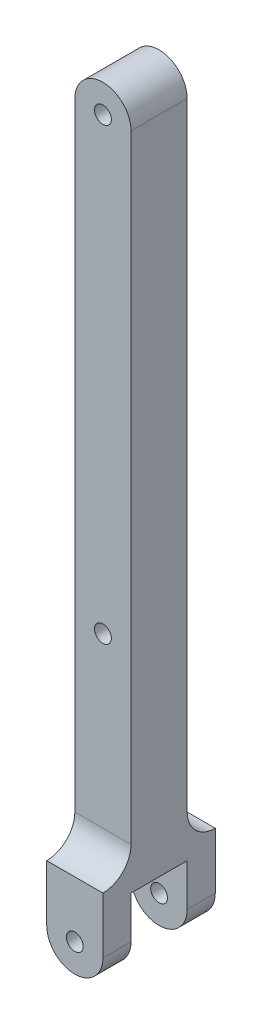
ISO-10303-21;
HEADER;
FILE_DESCRIPTION(('STEP AP214'),'2;1');
FILE_NAME('part.step','',(''),(''),'','','');
FILE_SCHEMA(('AUTOMOTIVE_DESIGN { 1 0 10303 214 1 1 1 1 }'));
ENDSEC;
DATA;
#1=APPLICATION_CONTEXT('core data for automotive mechanical design processes');
#2=APPLICATION_PROTOCOL_DEFINITION('international standard','automotive_design',2000,#1);
#3=PRODUCT_CONTEXT('',#1,'mechanical');
#4=PRODUCT('Part','Part','',(#3));
#5=PRODUCT_RELATED_PRODUCT_CATEGORY('part','',(#4));
#6=PRODUCT_DEFINITION_FORMATION('','',#4);
#7=PRODUCT_DEFINITION_CONTEXT('part definition',#1,'design');
#8=PRODUCT_DEFINITION('design','',#6,#7);
#9=PRODUCT_DEFINITION_SHAPE('','',#8);
#10=(LENGTH_UNIT() NAMED_UNIT(*) SI_UNIT(.MILLI.,.METRE.));
#11=(NAMED_UNIT(*) PLANE_ANGLE_UNIT() SI_UNIT($,.RADIAN.));
#12=(NAMED_UNIT(*) SI_UNIT($,.STERADIAN.) SOLID_ANGLE_UNIT());
#13=UNCERTAINTY_MEASURE_WITH_UNIT(LENGTH_MEASURE(1.E-05),#10,'distance_accuracy_value','');
#14=(GEOMETRIC_REPRESENTATION_CONTEXT(3) GLOBAL_UNCERTAINTY_ASSIGNED_CONTEXT((#13)) GLOBAL_UNIT_ASSIGNED_CONTEXT((#10,
#11,#12)) REPRESENTATION_CONTEXT('',''));
#15=CARTESIAN_POINT('',(0.,0.,0.));
#16=DIRECTION('',(0.,0.,1.));
#17=DIRECTION('',(1.,0.,0.));
#18=AXIS2_PLACEMENT_3D('',#15,#16,#17);
#19=CARTESIAN_POINT('',(0.,0.,10.));
#20=DIRECTION('',(0.,0.,1.));
#21=DIRECTION('',(1.,0.,0.));
#22=AXIS2_PLACEMENT_3D('',#19,#20,#21);
#23=PLANE('',#22);
#24=DIRECTION('',(0.,-1.,0.));
#25=VECTOR('',#24,1.);
#26=CARTESIAN_POINT('',(-5.,0.,10.));
#27=LINE('',#26,#25);
#28=CARTESIAN_POINT('',(-5.,0.,10.));
#29=VERTEX_POINT('',#28);
#30=CARTESIAN_POINT('',(-4.99999999999999,-110.,10.));
#31=VERTEX_POINT('',#30);
#32=EDGE_CURVE('E267',#29,#31,#27,.T.);
#33=ORIENTED_EDGE('',*,*,#32,.T.);
#34=DIRECTION('',(-1.,0.,0.));
#35=VECTOR('',#34,1.);
#36=CARTESIAN_POINT('',(1.52655665885959E-13,-110.,10.));
#37=LINE('',#36,#35);
#38=CARTESIAN_POINT('',(5.00000000000001,-110.,10.));
#39=VERTEX_POINT('',#38);
#40=EDGE_CURVE('E229',#31,#39,#37,.F.);
#41=ORIENTED_EDGE('',*,*,#40,.T.);
#42=DIRECTION('',(0.,1.,0.));
#43=VECTOR('',#42,1.);
#44=CARTESIAN_POINT('',(5.,0.,10.));
#45=LINE('',#44,#43);
#46=CARTESIAN_POINT('',(5.,0.,10.));
#47=VERTEX_POINT('',#46);
#48=EDGE_CURVE('E251',#39,#47,#45,.T.);
#49=ORIENTED_EDGE('',*,*,#48,.T.);
#50=CARTESIAN_POINT('',(0.,0.,10.));
#51=DIRECTION('',(0.,0.,1.));
#52=DIRECTION('',(1.,0.,0.));
#53=AXIS2_PLACEMENT_3D('',#50,#51,#52);
#54=CIRCLE('',#53,5.);
#55=EDGE_CURVE('E239',#47,#29,#54,.T.);
#56=ORIENTED_EDGE('',*,*,#55,.T.);
#57=EDGE_LOOP('',(#33,#41,#49,#56));
#58=FACE_BOUND('',#57,.T.);
#59=CARTESIAN_POINT('',(0.,0.,10.));
#60=DIRECTION('',(0.,0.,1.));
#61=DIRECTION('',(1.,0.,0.));
#62=AXIS2_PLACEMENT_3D('',#59,#60,#61);
#63=CIRCLE('',#62,1.5);
#64=CARTESIAN_POINT('',(1.5,0.,10.));
#65=VERTEX_POINT('',#64);
#66=EDGE_CURVE('E311',#65,#65,#63,.T.);
#67=ORIENTED_EDGE('',*,*,#66,.F.);
#68=EDGE_LOOP('',(#67));
#69=FACE_BOUND('',#68,.T.);
#70=CARTESIAN_POINT('',(0.,-80.,10.));
#71=DIRECTION('',(0.,0.,1.));
#72=DIRECTION('',(1.,0.,0.));
#73=AXIS2_PLACEMENT_3D('',#70,#71,#72);
#74=CIRCLE('',#73,1.5);
#75=CARTESIAN_POINT('',(1.50000000000001,-80.,10.));
#76=VERTEX_POINT('',#75);
#77=EDGE_CURVE('E305',#76,#76,#74,.T.);
#78=ORIENTED_EDGE('',*,*,#77,.F.);
#79=EDGE_LOOP('',(#78));
#80=FACE_BOUND('',#79,.T.);
#81=ADVANCED_FACE('F35',(#58,#69,#80),#23,.T.);
#82=CARTESIAN_POINT('',(0.,0.,0.));
#83=DIRECTION('',(0.,0.,1.));
#84=DIRECTION('',(1.,0.,0.));
#85=AXIS2_PLACEMENT_3D('',#82,#83,#84);
#86=PLANE('',#85);
#87=DIRECTION('',(0.,1.,0.));
#88=VECTOR('',#87,1.);
#89=CARTESIAN_POINT('',(5.,0.,0.));
#90=LINE('',#89,#88);
#91=CARTESIAN_POINT('',(5.00000000000001,-110.,0.));
#92=VERTEX_POINT('',#91);
#93=CARTESIAN_POINT('',(5.,0.,0.));
#94=VERTEX_POINT('',#93);
#95=EDGE_CURVE('E236',#92,#94,#90,.T.);
#96=ORIENTED_EDGE('',*,*,#95,.F.);
#97=DIRECTION('',(-1.,0.,0.));
#98=VECTOR('',#97,1.);
#99=CARTESIAN_POINT('',(1.52655665885959E-13,-110.,0.));
#100=LINE('',#99,#98);
#101=CARTESIAN_POINT('',(-4.99999999999999,-110.,0.));
#102=VERTEX_POINT('',#101);
#103=EDGE_CURVE('E232',#92,#102,#100,.T.);
#104=ORIENTED_EDGE('',*,*,#103,.T.);
#105=DIRECTION('',(0.,-1.,0.));
#106=VECTOR('',#105,1.);
#107=CARTESIAN_POINT('',(-5.,0.,0.));
#108=LINE('',#107,#106);
#109=CARTESIAN_POINT('',(-5.,0.,0.));
#110=VERTEX_POINT('',#109);
#111=EDGE_CURVE('E240',#110,#102,#108,.T.);
#112=ORIENTED_EDGE('',*,*,#111,.F.);
#113=CARTESIAN_POINT('',(0.,0.,0.));
#114=DIRECTION('',(0.,0.,1.));
#115=DIRECTION('',(1.,0.,0.));
#116=AXIS2_PLACEMENT_3D('',#113,#114,#115);
#117=CIRCLE('',#116,5.);
#118=EDGE_CURVE('E261',#94,#110,#117,.T.);
#119=ORIENTED_EDGE('',*,*,#118,.F.);
#120=EDGE_LOOP('',(#96,#104,#112,#119));
#121=FACE_BOUND('',#120,.T.);
#122=CARTESIAN_POINT('',(0.,0.,0.));
#123=DIRECTION('',(0.,0.,1.));
#124=DIRECTION('',(1.,0.,0.));
#125=AXIS2_PLACEMENT_3D('',#122,#123,#124);
#126=CIRCLE('',#125,1.5);
#127=CARTESIAN_POINT('',(1.5,0.,0.));
#128=VERTEX_POINT('',#127);
#129=EDGE_CURVE('E308',#128,#128,#126,.T.);
#130=ORIENTED_EDGE('',*,*,#129,.T.);
#131=EDGE_LOOP('',(#130));
#132=FACE_BOUND('',#131,.T.);
#133=CARTESIAN_POINT('',(0.,-80.,0.));
#134=DIRECTION('',(0.,0.,1.));
#135=DIRECTION('',(1.,0.,0.));
#136=AXIS2_PLACEMENT_3D('',#133,#134,#135);
#137=CIRCLE('',#136,1.5);
#138=CARTESIAN_POINT('',(1.50000000000001,-80.,0.));
#139=VERTEX_POINT('',#138);
#140=EDGE_CURVE('E304',#139,#139,#137,.T.);
#141=ORIENTED_EDGE('',*,*,#140,.T.);
#142=EDGE_LOOP('',(#141));
#143=FACE_BOUND('',#142,.T.);
#144=ADVANCED_FACE('F194',(#121,#132,#143),#86,.F.);
#145=CARTESIAN_POINT('',(0.,0.,10.));
#146=DIRECTION('',(0.,0.,-1.));
#147=DIRECTION('',(-1.,0.,0.));
#148=AXIS2_PLACEMENT_3D('',#145,#146,#147);
#149=CYLINDRICAL_SURFACE('',#148,5.);
#150=ORIENTED_EDGE('',*,*,#118,.T.);
#151=DIRECTION('',(0.,0.,-1.));
#152=VECTOR('',#151,1.);
#153=CARTESIAN_POINT('',(-5.,0.,10.));
#154=LINE('',#153,#152);
#155=EDGE_CURVE('E255',#29,#110,#154,.T.);
#156=ORIENTED_EDGE('',*,*,#155,.F.);
#157=ORIENTED_EDGE('',*,*,#55,.F.);
#158=DIRECTION('',(0.,0.,-1.));
#159=VECTOR('',#158,1.);
#160=CARTESIAN_POINT('',(5.,0.,10.));
#161=LINE('',#160,#159);
#162=EDGE_CURVE('E247',#47,#94,#161,.T.);
#163=ORIENTED_EDGE('',*,*,#162,.T.);
#164=EDGE_LOOP('',(#150,#156,#157,#163));
#165=FACE_BOUND('',#164,.T.);
#166=ADVANCED_FACE('F200',(#165),#149,.T.);
#167=CARTESIAN_POINT('',(-5.,0.,10.));
#168=DIRECTION('',(1.,0.,0.));
#169=DIRECTION('',(0.,1.,0.));
#170=AXIS2_PLACEMENT_3D('',#167,#168,#169);
#171=PLANE('',#170);
#172=DIRECTION('',(0.,0.,-1.));
#173=VECTOR('',#172,1.);
#174=CARTESIAN_POINT('',(-4.99999999999998,-125.,10.));
#175=LINE('',#174,#173);
#176=CARTESIAN_POINT('',(-4.99999999999999,-125.,0.));
#177=VERTEX_POINT('',#176);
#178=CARTESIAN_POINT('',(-4.99999999999998,-125.,-5.));
#179=VERTEX_POINT('',#178);
#180=EDGE_CURVE('E253',#177,#179,#175,.T.);
#181=ORIENTED_EDGE('',*,*,#180,.F.);
#182=DIRECTION('',(0.,-1.,0.));
#183=VECTOR('',#182,1.);
#184=CARTESIAN_POINT('',(-4.99999999999999,-130.,0.));
#185=LINE('',#184,#183);
#186=CARTESIAN_POINT('',(-4.99999999999999,-117.5,0.));
#187=VERTEX_POINT('',#186);
#188=EDGE_CURVE('E152',#187,#177,#185,.T.);
#189=ORIENTED_EDGE('',*,*,#188,.F.);
#190=DIRECTION('',(0.,0.,-1.));
#191=VECTOR('',#190,1.);
#192=CARTESIAN_POINT('',(-4.99999999999999,-117.5,0.));
#193=LINE('',#192,#191);
#194=CARTESIAN_POINT('',(-4.99999999999999,-117.5,10.));
#195=VERTEX_POINT('',#194);
#196=EDGE_CURVE('E156',#195,#187,#193,.T.);
#197=ORIENTED_EDGE('',*,*,#196,.F.);
#198=DIRECTION('',(0.,-1.,0.));
#199=VECTOR('',#198,1.);
#200=CARTESIAN_POINT('',(-4.99999999999998,-125.,10.));
#201=LINE('',#200,#199);
#202=CARTESIAN_POINT('',(-4.99999999999998,-125.,10.));
#203=VERTEX_POINT('',#202);
#204=EDGE_CURVE('E147',#195,#203,#201,.T.);
#205=ORIENTED_EDGE('',*,*,#204,.T.);
#206=DIRECTION('',(0.,0.,-1.));
#207=VECTOR('',#206,1.);
#208=CARTESIAN_POINT('',(-4.99999999999998,-125.,15.));
#209=LINE('',#208,#207);
#210=CARTESIAN_POINT('',(-4.99999999999998,-125.,15.));
#211=VERTEX_POINT('',#210);
#212=EDGE_CURVE('E153',#211,#203,#209,.T.);
#213=ORIENTED_EDGE('',*,*,#212,.F.);
#214=DIRECTION('',(0.,-1.,0.));
#215=VECTOR('',#214,1.);
#216=CARTESIAN_POINT('',(-4.99999999999998,-125.,15.));
#217=LINE('',#216,#215);
#218=CARTESIAN_POINT('',(-5.,-115.,15.));
#219=VERTEX_POINT('',#218);
#220=EDGE_CURVE('E143',#219,#211,#217,.T.);
#221=ORIENTED_EDGE('',*,*,#220,.F.);
#222=CARTESIAN_POINT('',(-4.99999999999999,-110.,15.));
#223=DIRECTION('',(1.,0.,0.));
#224=DIRECTION('',(0.,1.,0.));
#225=AXIS2_PLACEMENT_3D('',#222,#223,#224);
#226=CIRCLE('',#225,5.);
#227=EDGE_CURVE('E230',#219,#31,#226,.T.);
#228=ORIENTED_EDGE('',*,*,#227,.T.);
#229=ORIENTED_EDGE('',*,*,#32,.F.);
#230=ORIENTED_EDGE('',*,*,#155,.T.);
#231=ORIENTED_EDGE('',*,*,#111,.T.);
#232=CARTESIAN_POINT('',(-4.99999999999999,-110.,-5.));
#233=DIRECTION('',(1.,0.,0.));
#234=DIRECTION('',(0.,1.,0.));
#235=AXIS2_PLACEMENT_3D('',#232,#233,#234);
#236=CIRCLE('',#235,5.);
#237=CARTESIAN_POINT('',(-5.,-115.,-5.));
#238=VERTEX_POINT('',#237);
#239=EDGE_CURVE('E43',#102,#238,#236,.T.);
#240=ORIENTED_EDGE('',*,*,#239,.T.);
#241=DIRECTION('',(0.,-1.,0.));
#242=VECTOR('',#241,1.);
#243=CARTESIAN_POINT('',(-4.99999999999998,-125.,-5.));
#244=LINE('',#243,#242);
#245=EDGE_CURVE('E301',#238,#179,#244,.T.);
#246=ORIENTED_EDGE('',*,*,#245,.T.);
#247=EDGE_LOOP('',(#181,#189,#197,#205,#213,#221,#228,#229,#230,#231,#240,#246));
#248=FACE_BOUND('',#247,.T.);
#249=ADVANCED_FACE('F214',(#248),#171,.F.);
#250=CARTESIAN_POINT('',(0.,-125.,10.));
#251=DIRECTION('',(0.,0.,-1.));
#252=DIRECTION('',(-1.,0.,0.));
#253=AXIS2_PLACEMENT_3D('',#250,#251,#252);
#254=CYLINDRICAL_SURFACE('',#253,5.);
#255=DIRECTION('',(0.,0.,-1.));
#256=VECTOR('',#255,1.);
#257=CARTESIAN_POINT('',(5.00000000000002,-125.,10.));
#258=LINE('',#257,#256);
#259=CARTESIAN_POINT('',(5.00000000000002,-125.,0.));
#260=VERTEX_POINT('',#259);
#261=CARTESIAN_POINT('',(5.00000000000002,-125.,-5.));
#262=VERTEX_POINT('',#261);
#263=EDGE_CURVE('E250',#260,#262,#258,.T.);
#264=ORIENTED_EDGE('',*,*,#263,.F.);
#265=CARTESIAN_POINT('',(0.,-125.,0.));
#266=DIRECTION('',(0.,0.,-1.));
#267=DIRECTION('',(-1.,0.,0.));
#268=AXIS2_PLACEMENT_3D('',#265,#266,#267);
#269=CIRCLE('',#268,5.);
#270=EDGE_CURVE('E289',#260,#177,#269,.T.);
#271=ORIENTED_EDGE('',*,*,#270,.T.);
#272=ORIENTED_EDGE('',*,*,#180,.T.);
#273=CARTESIAN_POINT('',(0.,-125.,-5.));
#274=DIRECTION('',(0.,0.,1.));
#275=DIRECTION('',(1.,0.,0.));
#276=AXIS2_PLACEMENT_3D('',#273,#274,#275);
#277=CIRCLE('',#276,5.);
#278=EDGE_CURVE('E294',#179,#262,#277,.T.);
#279=ORIENTED_EDGE('',*,*,#278,.T.);
#280=EDGE_LOOP('',(#264,#271,#272,#279));
#281=FACE_BOUND('',#280,.T.);
#282=ADVANCED_FACE('F211',(#281),#254,.T.);
#283=CARTESIAN_POINT('',(5.,0.,10.));
#284=DIRECTION('',(-1.,0.,0.));
#285=DIRECTION('',(0.,-1.,0.));
#286=AXIS2_PLACEMENT_3D('',#283,#284,#285);
#287=PLANE('',#286);
#288=DIRECTION('',(0.,0.,-1.));
#289=VECTOR('',#288,1.);
#290=CARTESIAN_POINT('',(5.00000000000002,-117.5,10.));
#291=LINE('',#290,#289);
#292=CARTESIAN_POINT('',(5.00000000000002,-117.5,10.));
#293=VERTEX_POINT('',#292);
#294=CARTESIAN_POINT('',(5.00000000000002,-117.5,0.));
#295=VERTEX_POINT('',#294);
#296=EDGE_CURVE('E258',#293,#295,#291,.T.);
#297=ORIENTED_EDGE('',*,*,#296,.T.);
#298=DIRECTION('',(0.,-1.,0.));
#299=VECTOR('',#298,1.);
#300=CARTESIAN_POINT('',(5.,0.,0.));
#301=LINE('',#300,#299);
#302=EDGE_CURVE('E265',#295,#260,#301,.T.);
#303=ORIENTED_EDGE('',*,*,#302,.T.);
#304=ORIENTED_EDGE('',*,*,#263,.T.);
#305=DIRECTION('',(0.,1.,0.));
#306=VECTOR('',#305,1.);
#307=CARTESIAN_POINT('',(5.00000000000002,-115.,-5.));
#308=LINE('',#307,#306);
#309=CARTESIAN_POINT('',(5.00000000000002,-115.,-5.));
#310=VERTEX_POINT('',#309);
#311=EDGE_CURVE('E297',#262,#310,#308,.T.);
#312=ORIENTED_EDGE('',*,*,#311,.T.);
#313=CARTESIAN_POINT('',(5.00000000000001,-110.,-5.));
#314=DIRECTION('',(-1.,0.,0.));
#315=DIRECTION('',(0.,-1.,0.));
#316=AXIS2_PLACEMENT_3D('',#313,#314,#315);
#317=CIRCLE('',#316,5.);
#318=EDGE_CURVE('E11',#310,#92,#317,.T.);
#319=ORIENTED_EDGE('',*,*,#318,.T.);
#320=ORIENTED_EDGE('',*,*,#95,.T.);
#321=ORIENTED_EDGE('',*,*,#162,.F.);
#322=ORIENTED_EDGE('',*,*,#48,.F.);
#323=CARTESIAN_POINT('',(5.00000000000001,-110.,15.));
#324=DIRECTION('',(-1.,0.,0.));
#325=DIRECTION('',(0.,-1.,0.));
#326=AXIS2_PLACEMENT_3D('',#323,#324,#325);
#327=CIRCLE('',#326,5.);
#328=CARTESIAN_POINT('',(5.00000000000002,-115.,15.));
#329=VERTEX_POINT('',#328);
#330=EDGE_CURVE('E132',#39,#329,#327,.T.);
#331=ORIENTED_EDGE('',*,*,#330,.T.);
#332=DIRECTION('',(0.,1.,0.));
#333=VECTOR('',#332,1.);
#334=CARTESIAN_POINT('',(5.00000000000002,-115.,15.));
#335=LINE('',#334,#333);
#336=CARTESIAN_POINT('',(5.00000000000002,-125.,15.));
#337=VERTEX_POINT('',#336);
#338=EDGE_CURVE('E122',#337,#329,#335,.T.);
#339=ORIENTED_EDGE('',*,*,#338,.F.);
#340=DIRECTION('',(0.,0.,-1.));
#341=VECTOR('',#340,1.);
#342=CARTESIAN_POINT('',(5.00000000000002,-125.,15.));
#343=LINE('',#342,#341);
#344=CARTESIAN_POINT('',(5.00000000000002,-125.,10.));
#345=VERTEX_POINT('',#344);
#346=EDGE_CURVE('E128',#337,#345,#343,.T.);
#347=ORIENTED_EDGE('',*,*,#346,.T.);
#348=DIRECTION('',(0.,1.,0.));
#349=VECTOR('',#348,1.);
#350=CARTESIAN_POINT('',(5.00000000000002,-115.,10.));
#351=LINE('',#350,#349);
#352=EDGE_CURVE('E162',#345,#293,#351,.T.);
#353=ORIENTED_EDGE('',*,*,#352,.T.);
#354=EDGE_LOOP('',(#297,#303,#304,#312,#319,#320,#321,#322,#331,#339,#347,#353));
#355=FACE_BOUND('',#354,.T.);
#356=ADVANCED_FACE('F125',(#355),#287,.F.);
#357=CARTESIAN_POINT('',(0.,0.,10.));
#358=DIRECTION('',(0.,0.,-1.));
#359=DIRECTION('',(-1.,0.,0.));
#360=AXIS2_PLACEMENT_3D('',#357,#358,#359);
#361=CYLINDRICAL_SURFACE('',#360,1.5);
#362=ORIENTED_EDGE('',*,*,#66,.T.);
#363=EDGE_LOOP('',(#362));
#364=FACE_BOUND('',#363,.T.);
#365=ORIENTED_EDGE('',*,*,#129,.F.);
#366=EDGE_LOOP('',(#365));
#367=FACE_BOUND('',#366,.T.);
#368=ADVANCED_FACE('F206',(#364,#367),#361,.F.);
#369=CARTESIAN_POINT('',(0.,-125.,10.));
#370=DIRECTION('',(0.,0.,-1.));
#371=DIRECTION('',(-1.,0.,0.));
#372=AXIS2_PLACEMENT_3D('',#369,#370,#371);
#373=CYLINDRICAL_SURFACE('',#372,1.5);
#374=CARTESIAN_POINT('',(0.,-125.,0.));
#375=DIRECTION('',(0.,0.,-1.));
#376=DIRECTION('',(-1.,0.,0.));
#377=AXIS2_PLACEMENT_3D('',#374,#375,#376);
#378=CIRCLE('',#377,1.5);
#379=CARTESIAN_POINT('',(-1.49999999999999,-125.,0.));
#380=VERTEX_POINT('',#379);
#381=EDGE_CURVE('E262',#380,#380,#378,.T.);
#382=ORIENTED_EDGE('',*,*,#381,.F.);
#383=EDGE_LOOP('',(#382));
#384=FACE_BOUND('',#383,.T.);
#385=CARTESIAN_POINT('',(0.,-125.,-5.));
#386=DIRECTION('',(0.,0.,1.));
#387=DIRECTION('',(1.,0.,0.));
#388=AXIS2_PLACEMENT_3D('',#385,#386,#387);
#389=CIRCLE('',#388,1.5);
#390=CARTESIAN_POINT('',(1.50000000000002,-125.,-5.));
#391=VERTEX_POINT('',#390);
#392=EDGE_CURVE('E291',#391,#391,#389,.T.);
#393=ORIENTED_EDGE('',*,*,#392,.F.);
#394=EDGE_LOOP('',(#393));
#395=FACE_BOUND('',#394,.T.);
#396=ADVANCED_FACE('F319',(#384,#395),#373,.F.);
#397=CARTESIAN_POINT('',(0.,-80.,10.));
#398=DIRECTION('',(0.,0.,-1.));
#399=DIRECTION('',(-1.,0.,0.));
#400=AXIS2_PLACEMENT_3D('',#397,#398,#399);
#401=CYLINDRICAL_SURFACE('',#400,1.5);
#402=ORIENTED_EDGE('',*,*,#77,.T.);
#403=EDGE_LOOP('',(#402));
#404=FACE_BOUND('',#403,.T.);
#405=ORIENTED_EDGE('',*,*,#140,.F.);
#406=EDGE_LOOP('',(#405));
#407=FACE_BOUND('',#406,.T.);
#408=ADVANCED_FACE('F324',(#404,#407),#401,.F.);
#409=CARTESIAN_POINT('',(0.,-125.,-5.));
#410=DIRECTION('',(0.,0.,1.));
#411=DIRECTION('',(1.,0.,0.));
#412=AXIS2_PLACEMENT_3D('',#409,#410,#411);
#413=PLANE('',#412);
#414=ORIENTED_EDGE('',*,*,#392,.T.);
#415=EDGE_LOOP('',(#414));
#416=FACE_BOUND('',#415,.T.);
#417=ORIENTED_EDGE('',*,*,#278,.F.);
#418=ORIENTED_EDGE('',*,*,#245,.F.);
#419=DIRECTION('',(-1.,0.,0.));
#420=VECTOR('',#419,1.);
#421=CARTESIAN_POINT('',(-5.,-115.,-5.));
#422=LINE('',#421,#420);
#423=EDGE_CURVE('E299',#310,#238,#422,.T.);
#424=ORIENTED_EDGE('',*,*,#423,.F.);
#425=ORIENTED_EDGE('',*,*,#311,.F.);
#426=EDGE_LOOP('',(#417,#418,#424,#425));
#427=FACE_BOUND('',#426,.T.);
#428=ADVANCED_FACE('F332',(#416,#427),#413,.F.);
#429=CARTESIAN_POINT('',(11.,-117.5,0.));
#430=DIRECTION('',(0.,1.,0.));
#431=DIRECTION('',(-1.,0.,0.));
#432=AXIS2_PLACEMENT_3D('',#429,#430,#431);
#433=PLANE('',#432);
#434=DIRECTION('',(-1.,0.,0.));
#435=VECTOR('',#434,1.);
#436=CARTESIAN_POINT('',(11.,-117.5,10.));
#437=LINE('',#436,#435);
#438=EDGE_CURVE('E281',#293,#195,#437,.T.);
#439=ORIENTED_EDGE('',*,*,#438,.T.);
#440=ORIENTED_EDGE('',*,*,#196,.T.);
#441=DIRECTION('',(-1.,0.,0.));
#442=VECTOR('',#441,1.);
#443=CARTESIAN_POINT('',(11.,-117.5,0.));
#444=LINE('',#443,#442);
#445=EDGE_CURVE('E266',#295,#187,#444,.T.);
#446=ORIENTED_EDGE('',*,*,#445,.F.);
#447=ORIENTED_EDGE('',*,*,#296,.F.);
#448=EDGE_LOOP('',(#439,#440,#446,#447));
#449=FACE_BOUND('',#448,.T.);
#450=ADVANCED_FACE('F189',(#449),#433,.F.);
#451=CARTESIAN_POINT('',(11.,-130.,0.));
#452=DIRECTION('',(0.,0.,-1.));
#453=DIRECTION('',(-1.,0.,0.));
#454=AXIS2_PLACEMENT_3D('',#451,#452,#453);
#455=PLANE('',#454);
#456=ORIENTED_EDGE('',*,*,#381,.T.);
#457=EDGE_LOOP('',(#456));
#458=FACE_BOUND('',#457,.T.);
#459=ORIENTED_EDGE('',*,*,#270,.F.);
#460=ORIENTED_EDGE('',*,*,#302,.F.);
#461=ORIENTED_EDGE('',*,*,#445,.T.);
#462=ORIENTED_EDGE('',*,*,#188,.T.);
#463=EDGE_LOOP('',(#459,#460,#461,#462));
#464=FACE_BOUND('',#463,.T.);
#465=ADVANCED_FACE('F181',(#458,#464),#455,.F.);
#466=CARTESIAN_POINT('',(0.,-125.,15.));
#467=DIRECTION('',(0.,0.,1.));
#468=DIRECTION('',(1.,0.,0.));
#469=AXIS2_PLACEMENT_3D('',#466,#467,#468);
#470=PLANE('',#469);
#471=CARTESIAN_POINT('',(0.,-125.,15.));
#472=DIRECTION('',(0.,0.,1.));
#473=DIRECTION('',(1.,0.,0.));
#474=AXIS2_PLACEMENT_3D('',#471,#472,#473);
#475=CIRCLE('',#474,5.);
#476=EDGE_CURVE('E137',#211,#337,#475,.T.);
#477=ORIENTED_EDGE('',*,*,#476,.T.);
#478=ORIENTED_EDGE('',*,*,#338,.T.);
#479=DIRECTION('',(-1.,0.,0.));
#480=VECTOR('',#479,1.);
#481=CARTESIAN_POINT('',(-5.,-115.,15.));
#482=LINE('',#481,#480);
#483=EDGE_CURVE('E136',#329,#219,#482,.T.);
#484=ORIENTED_EDGE('',*,*,#483,.T.);
#485=ORIENTED_EDGE('',*,*,#220,.T.);
#486=EDGE_LOOP('',(#477,#478,#484,#485));
#487=FACE_BOUND('',#486,.T.);
#488=CARTESIAN_POINT('',(0.,-125.,15.));
#489=DIRECTION('',(0.,0.,1.));
#490=DIRECTION('',(1.,0.,0.));
#491=AXIS2_PLACEMENT_3D('',#488,#489,#490);
#492=CIRCLE('',#491,1.5);
#493=CARTESIAN_POINT('',(1.50000000000002,-125.,15.));
#494=VERTEX_POINT('',#493);
#495=EDGE_CURVE('E168',#494,#494,#492,.T.);
#496=ORIENTED_EDGE('',*,*,#495,.F.);
#497=EDGE_LOOP('',(#496));
#498=FACE_BOUND('',#497,.T.);
#499=ADVANCED_FACE('F140',(#487,#498),#470,.T.);
#500=CARTESIAN_POINT('',(0.,-125.,10.));
#501=DIRECTION('',(0.,0.,1.));
#502=DIRECTION('',(1.,0.,0.));
#503=AXIS2_PLACEMENT_3D('',#500,#501,#502);
#504=PLANE('',#503);
#505=ORIENTED_EDGE('',*,*,#438,.F.);
#506=ORIENTED_EDGE('',*,*,#352,.F.);
#507=CARTESIAN_POINT('',(0.,-125.,10.));
#508=DIRECTION('',(0.,0.,1.));
#509=DIRECTION('',(1.,0.,0.));
#510=AXIS2_PLACEMENT_3D('',#507,#508,#509);
#511=CIRCLE('',#510,5.);
#512=EDGE_CURVE('E151',#203,#345,#511,.T.);
#513=ORIENTED_EDGE('',*,*,#512,.F.);
#514=ORIENTED_EDGE('',*,*,#204,.F.);
#515=EDGE_LOOP('',(#505,#506,#513,#514));
#516=FACE_BOUND('',#515,.T.);
#517=CARTESIAN_POINT('',(0.,-125.,10.));
#518=DIRECTION('',(0.,0.,1.));
#519=DIRECTION('',(1.,0.,0.));
#520=AXIS2_PLACEMENT_3D('',#517,#518,#519);
#521=CIRCLE('',#520,1.5);
#522=CARTESIAN_POINT('',(1.50000000000002,-125.,10.));
#523=VERTEX_POINT('',#522);
#524=EDGE_CURVE('E171',#523,#523,#521,.T.);
#525=ORIENTED_EDGE('',*,*,#524,.T.);
#526=EDGE_LOOP('',(#525));
#527=FACE_BOUND('',#526,.T.);
#528=ADVANCED_FACE('F180',(#516,#527),#504,.F.);
#529=CARTESIAN_POINT('',(0.,-125.,15.));
#530=DIRECTION('',(0.,0.,-1.));
#531=DIRECTION('',(-1.,0.,0.));
#532=AXIS2_PLACEMENT_3D('',#529,#530,#531);
#533=CYLINDRICAL_SURFACE('',#532,5.);
#534=ORIENTED_EDGE('',*,*,#512,.T.);
#535=ORIENTED_EDGE('',*,*,#346,.F.);
#536=ORIENTED_EDGE('',*,*,#476,.F.);
#537=ORIENTED_EDGE('',*,*,#212,.T.);
#538=EDGE_LOOP('',(#534,#535,#536,#537));
#539=FACE_BOUND('',#538,.T.);
#540=ADVANCED_FACE('F149',(#539),#533,.T.);
#541=CARTESIAN_POINT('',(0.,-125.,15.));
#542=DIRECTION('',(0.,0.,-1.));
#543=DIRECTION('',(-1.,0.,0.));
#544=AXIS2_PLACEMENT_3D('',#541,#542,#543);
#545=CYLINDRICAL_SURFACE('',#544,1.5);
#546=ORIENTED_EDGE('',*,*,#495,.T.);
#547=EDGE_LOOP('',(#546));
#548=FACE_BOUND('',#547,.T.);
#549=ORIENTED_EDGE('',*,*,#524,.F.);
#550=EDGE_LOOP('',(#549));
#551=FACE_BOUND('',#550,.T.);
#552=ADVANCED_FACE('F177',(#548,#551),#545,.F.);
#553=CARTESIAN_POINT('',(-5.00000000000001,-110.,15.));
#554=DIRECTION('',(-1.,0.,0.));
#555=DIRECTION('',(0.,-1.,0.));
#556=AXIS2_PLACEMENT_3D('',#553,#554,#555);
#557=CYLINDRICAL_SURFACE('',#556,5.);
#558=ORIENTED_EDGE('',*,*,#330,.F.);
#559=ORIENTED_EDGE('',*,*,#40,.F.);
#560=ORIENTED_EDGE('',*,*,#227,.F.);
#561=ORIENTED_EDGE('',*,*,#483,.F.);
#562=EDGE_LOOP('',(#558,#559,#560,#561));
#563=FACE_BOUND('',#562,.T.);
#564=ADVANCED_FACE('F221',(#563),#557,.F.);
#565=CARTESIAN_POINT('',(1.52655665885959E-13,-110.,-5.));
#566=DIRECTION('',(-1.,0.,0.));
#567=DIRECTION('',(0.,-1.,0.));
#568=AXIS2_PLACEMENT_3D('',#565,#566,#567);
#569=CYLINDRICAL_SURFACE('',#568,5.);
#570=ORIENTED_EDGE('',*,*,#318,.F.);
#571=ORIENTED_EDGE('',*,*,#423,.T.);
#572=ORIENTED_EDGE('',*,*,#239,.F.);
#573=ORIENTED_EDGE('',*,*,#103,.F.);
#574=EDGE_LOOP('',(#570,#571,#572,#573));
#575=FACE_BOUND('',#574,.T.);
#576=ADVANCED_FACE('F37',(#575),#569,.F.);
#577=CLOSED_SHELL('',(#81,#144,#166,#249,#282,#356,#368,#396,#408,#428,#450,#465,#499,#528,#540,
#552,#564,#576));
#578=MANIFOLD_SOLID_BREP('B2',#577);
#579=ADVANCED_BREP_SHAPE_REPRESENTATION('',(#18,#578),#14);
#580=SHAPE_DEFINITION_REPRESENTATION(#9,#579);
ENDSEC;
END-ISO-10303-21;
